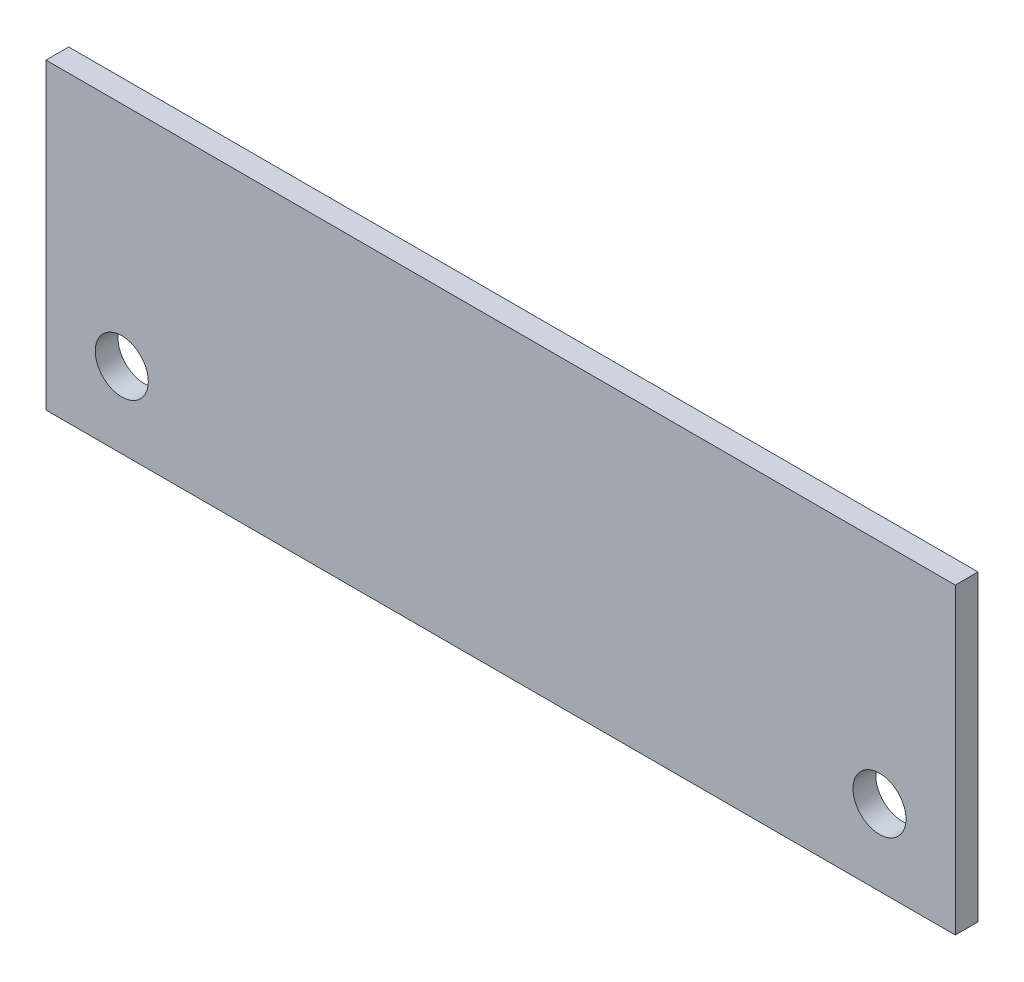
ISO-10303-21;
HEADER;
FILE_DESCRIPTION(('STEP AP214'),'2;1');
FILE_NAME('part.step','',(''),(''),'','','');
FILE_SCHEMA(('AUTOMOTIVE_DESIGN { 1 0 10303 214 1 1 1 1 }'));
ENDSEC;
DATA;
#1=APPLICATION_CONTEXT('core data for automotive mechanical design processes');
#2=APPLICATION_PROTOCOL_DEFINITION('international standard','automotive_design',2000,#1);
#3=PRODUCT_CONTEXT('',#1,'mechanical');
#4=PRODUCT('Part','Part','',(#3));
#5=PRODUCT_RELATED_PRODUCT_CATEGORY('part','',(#4));
#6=PRODUCT_DEFINITION_FORMATION('','',#4);
#7=PRODUCT_DEFINITION_CONTEXT('part definition',#1,'design');
#8=PRODUCT_DEFINITION('design','',#6,#7);
#9=PRODUCT_DEFINITION_SHAPE('','',#8);
#10=(LENGTH_UNIT() NAMED_UNIT(*) SI_UNIT(.MILLI.,.METRE.));
#11=(NAMED_UNIT(*) PLANE_ANGLE_UNIT() SI_UNIT($,.RADIAN.));
#12=(NAMED_UNIT(*) SI_UNIT($,.STERADIAN.) SOLID_ANGLE_UNIT());
#13=UNCERTAINTY_MEASURE_WITH_UNIT(LENGTH_MEASURE(1.E-05),#10,'distance_accuracy_value','');
#14=(GEOMETRIC_REPRESENTATION_CONTEXT(3) GLOBAL_UNCERTAINTY_ASSIGNED_CONTEXT((#13)) GLOBAL_UNIT_ASSIGNED_CONTEXT((#10,
#11,#12)) REPRESENTATION_CONTEXT('',''));
#15=CARTESIAN_POINT('',(0.,0.,0.));
#16=DIRECTION('',(0.,0.,1.));
#17=DIRECTION('',(1.,0.,0.));
#18=AXIS2_PLACEMENT_3D('',#15,#16,#17);
#19=CARTESIAN_POINT('',(0.,0.,6.));
#20=DIRECTION('',(0.,0.,-1.));
#21=DIRECTION('',(-1.,0.,0.));
#22=AXIS2_PLACEMENT_3D('',#19,#20,#21);
#23=PLANE('',#22);
#24=DIRECTION('',(0.,1.,0.));
#25=VECTOR('',#24,1.);
#26=CARTESIAN_POINT('',(120.,-40.,6.));
#27=LINE('',#26,#25);
#28=CARTESIAN_POINT('',(120.,-40.,6.));
#29=VERTEX_POINT('',#28);
#30=CARTESIAN_POINT('',(120.,40.,6.));
#31=VERTEX_POINT('',#30);
#32=EDGE_CURVE('E85',#29,#31,#27,.T.);
#33=ORIENTED_EDGE('',*,*,#32,.T.);
#34=DIRECTION('',(-1.,0.,0.));
#35=VECTOR('',#34,1.);
#36=CARTESIAN_POINT('',(-120.,40.,6.));
#37=LINE('',#36,#35);
#38=CARTESIAN_POINT('',(-120.,40.,6.));
#39=VERTEX_POINT('',#38);
#40=EDGE_CURVE('E80',#31,#39,#37,.T.);
#41=ORIENTED_EDGE('',*,*,#40,.T.);
#42=DIRECTION('',(0.,-1.,0.));
#43=VECTOR('',#42,1.);
#44=CARTESIAN_POINT('',(-120.,-40.,6.));
#45=LINE('',#44,#43);
#46=CARTESIAN_POINT('',(-120.,-40.,6.));
#47=VERTEX_POINT('',#46);
#48=EDGE_CURVE('E83',#39,#47,#45,.T.);
#49=ORIENTED_EDGE('',*,*,#48,.T.);
#50=DIRECTION('',(1.,0.,0.));
#51=VECTOR('',#50,1.);
#52=CARTESIAN_POINT('',(-120.,-40.,6.));
#53=LINE('',#52,#51);
#54=EDGE_CURVE('E50',#47,#29,#53,.T.);
#55=ORIENTED_EDGE('',*,*,#54,.T.);
#56=EDGE_LOOP('',(#33,#41,#49,#55));
#57=FACE_BOUND('',#56,.T.);
#58=CARTESIAN_POINT('',(-100.,-20.,6.));
#59=DIRECTION('',(0.,0.,1.));
#60=DIRECTION('',(1.,0.,0.));
#61=AXIS2_PLACEMENT_3D('',#58,#59,#60);
#62=CIRCLE('',#61,7.);
#63=CARTESIAN_POINT('',(-93.,-20.,6.));
#64=VERTEX_POINT('',#63);
#65=EDGE_CURVE('E100',#64,#64,#62,.T.);
#66=ORIENTED_EDGE('',*,*,#65,.F.);
#67=EDGE_LOOP('',(#66));
#68=FACE_BOUND('',#67,.T.);
#69=CARTESIAN_POINT('',(100.,-20.,6.));
#70=DIRECTION('',(0.,0.,1.));
#71=DIRECTION('',(1.,0.,0.));
#72=AXIS2_PLACEMENT_3D('',#69,#70,#71);
#73=CIRCLE('',#72,7.);
#74=CARTESIAN_POINT('',(107.,-20.,6.));
#75=VERTEX_POINT('',#74);
#76=EDGE_CURVE('E115',#75,#75,#73,.T.);
#77=ORIENTED_EDGE('',*,*,#76,.F.);
#78=EDGE_LOOP('',(#77));
#79=FACE_BOUND('',#78,.T.);
#80=ADVANCED_FACE('F33',(#57,#68,#79),#23,.F.);
#81=CARTESIAN_POINT('',(0.,0.,0.));
#82=DIRECTION('',(0.,0.,-1.));
#83=DIRECTION('',(-1.,0.,0.));
#84=AXIS2_PLACEMENT_3D('',#81,#82,#83);
#85=PLANE('',#84);
#86=CARTESIAN_POINT('',(-100.,-20.,0.));
#87=DIRECTION('',(0.,0.,1.));
#88=DIRECTION('',(1.,0.,0.));
#89=AXIS2_PLACEMENT_3D('',#86,#87,#88);
#90=CIRCLE('',#89,7.);
#91=CARTESIAN_POINT('',(-93.,-20.,0.));
#92=VERTEX_POINT('',#91);
#93=EDGE_CURVE('E112',#92,#92,#90,.T.);
#94=ORIENTED_EDGE('',*,*,#93,.T.);
#95=EDGE_LOOP('',(#94));
#96=FACE_BOUND('',#95,.T.);
#97=DIRECTION('',(0.,1.,0.));
#98=VECTOR('',#97,1.);
#99=CARTESIAN_POINT('',(120.,-40.,0.));
#100=LINE('',#99,#98);
#101=CARTESIAN_POINT('',(120.,-40.,0.));
#102=VERTEX_POINT('',#101);
#103=CARTESIAN_POINT('',(120.,40.,0.));
#104=VERTEX_POINT('',#103);
#105=EDGE_CURVE('E97',#102,#104,#100,.T.);
#106=ORIENTED_EDGE('',*,*,#105,.F.);
#107=DIRECTION('',(1.,0.,0.));
#108=VECTOR('',#107,1.);
#109=CARTESIAN_POINT('',(-120.,-40.,0.));
#110=LINE('',#109,#108);
#111=CARTESIAN_POINT('',(-120.,-40.,0.));
#112=VERTEX_POINT('',#111);
#113=EDGE_CURVE('E73',#112,#102,#110,.T.);
#114=ORIENTED_EDGE('',*,*,#113,.F.);
#115=DIRECTION('',(0.,-1.,0.));
#116=VECTOR('',#115,1.);
#117=CARTESIAN_POINT('',(-120.,-40.,0.));
#118=LINE('',#117,#116);
#119=CARTESIAN_POINT('',(-120.,40.,0.));
#120=VERTEX_POINT('',#119);
#121=EDGE_CURVE('E67',#120,#112,#118,.T.);
#122=ORIENTED_EDGE('',*,*,#121,.F.);
#123=DIRECTION('',(-1.,0.,0.));
#124=VECTOR('',#123,1.);
#125=CARTESIAN_POINT('',(-120.,40.,0.));
#126=LINE('',#125,#124);
#127=EDGE_CURVE('E89',#104,#120,#126,.T.);
#128=ORIENTED_EDGE('',*,*,#127,.F.);
#129=EDGE_LOOP('',(#106,#114,#122,#128));
#130=FACE_BOUND('',#129,.T.);
#131=CARTESIAN_POINT('',(100.,-20.,0.));
#132=DIRECTION('',(0.,0.,1.));
#133=DIRECTION('',(1.,0.,0.));
#134=AXIS2_PLACEMENT_3D('',#131,#132,#133);
#135=CIRCLE('',#134,7.);
#136=CARTESIAN_POINT('',(107.,-20.,0.));
#137=VERTEX_POINT('',#136);
#138=EDGE_CURVE('E118',#137,#137,#135,.T.);
#139=ORIENTED_EDGE('',*,*,#138,.T.);
#140=EDGE_LOOP('',(#139));
#141=FACE_BOUND('',#140,.T.);
#142=ADVANCED_FACE('F108',(#96,#130,#141),#85,.T.);
#143=CARTESIAN_POINT('',(120.,-40.,6.));
#144=DIRECTION('',(-1.,0.,0.));
#145=DIRECTION('',(0.,0.,1.));
#146=AXIS2_PLACEMENT_3D('',#143,#144,#145);
#147=PLANE('',#146);
#148=ORIENTED_EDGE('',*,*,#105,.T.);
#149=DIRECTION('',(0.,0.,-1.));
#150=VECTOR('',#149,1.);
#151=CARTESIAN_POINT('',(120.,40.,6.));
#152=LINE('',#151,#150);
#153=EDGE_CURVE('E11',#31,#104,#152,.T.);
#154=ORIENTED_EDGE('',*,*,#153,.F.);
#155=ORIENTED_EDGE('',*,*,#32,.F.);
#156=DIRECTION('',(0.,0.,-1.));
#157=VECTOR('',#156,1.);
#158=CARTESIAN_POINT('',(120.,-40.,6.));
#159=LINE('',#158,#157);
#160=EDGE_CURVE('E93',#29,#102,#159,.T.);
#161=ORIENTED_EDGE('',*,*,#160,.T.);
#162=EDGE_LOOP('',(#148,#154,#155,#161));
#163=FACE_BOUND('',#162,.T.);
#164=ADVANCED_FACE('F35',(#163),#147,.F.);
#165=CARTESIAN_POINT('',(-120.,40.,6.));
#166=DIRECTION('',(0.,-1.,0.));
#167=DIRECTION('',(0.,0.,-1.));
#168=AXIS2_PLACEMENT_3D('',#165,#166,#167);
#169=PLANE('',#168);
#170=ORIENTED_EDGE('',*,*,#127,.T.);
#171=DIRECTION('',(0.,0.,-1.));
#172=VECTOR('',#171,1.);
#173=CARTESIAN_POINT('',(-120.,40.,6.));
#174=LINE('',#173,#172);
#175=EDGE_CURVE('E42',#39,#120,#174,.T.);
#176=ORIENTED_EDGE('',*,*,#175,.F.);
#177=ORIENTED_EDGE('',*,*,#40,.F.);
#178=ORIENTED_EDGE('',*,*,#153,.T.);
#179=EDGE_LOOP('',(#170,#176,#177,#178));
#180=FACE_BOUND('',#179,.T.);
#181=ADVANCED_FACE('F88',(#180),#169,.F.);
#182=CARTESIAN_POINT('',(-120.,-40.,6.));
#183=DIRECTION('',(1.,0.,0.));
#184=DIRECTION('',(0.,0.,-1.));
#185=AXIS2_PLACEMENT_3D('',#182,#183,#184);
#186=PLANE('',#185);
#187=ORIENTED_EDGE('',*,*,#121,.T.);
#188=DIRECTION('',(0.,0.,-1.));
#189=VECTOR('',#188,1.);
#190=CARTESIAN_POINT('',(-120.,-40.,6.));
#191=LINE('',#190,#189);
#192=EDGE_CURVE('E90',#47,#112,#191,.T.);
#193=ORIENTED_EDGE('',*,*,#192,.F.);
#194=ORIENTED_EDGE('',*,*,#48,.F.);
#195=ORIENTED_EDGE('',*,*,#175,.T.);
#196=EDGE_LOOP('',(#187,#193,#194,#195));
#197=FACE_BOUND('',#196,.T.);
#198=ADVANCED_FACE('F91',(#197),#186,.F.);
#199=CARTESIAN_POINT('',(-120.,-40.,6.));
#200=DIRECTION('',(0.,1.,0.));
#201=DIRECTION('',(0.,0.,1.));
#202=AXIS2_PLACEMENT_3D('',#199,#200,#201);
#203=PLANE('',#202);
#204=ORIENTED_EDGE('',*,*,#113,.T.);
#205=ORIENTED_EDGE('',*,*,#160,.F.);
#206=ORIENTED_EDGE('',*,*,#54,.F.);
#207=ORIENTED_EDGE('',*,*,#192,.T.);
#208=EDGE_LOOP('',(#204,#205,#206,#207));
#209=FACE_BOUND('',#208,.T.);
#210=ADVANCED_FACE('F105',(#209),#203,.F.);
#211=CARTESIAN_POINT('',(-100.,-20.,6.));
#212=DIRECTION('',(0.,0.,-1.));
#213=DIRECTION('',(-1.,0.,0.));
#214=AXIS2_PLACEMENT_3D('',#211,#212,#213);
#215=CYLINDRICAL_SURFACE('',#214,7.);
#216=ORIENTED_EDGE('',*,*,#65,.T.);
#217=EDGE_LOOP('',(#216));
#218=FACE_BOUND('',#217,.T.);
#219=ORIENTED_EDGE('',*,*,#93,.F.);
#220=EDGE_LOOP('',(#219));
#221=FACE_BOUND('',#220,.T.);
#222=ADVANCED_FACE('F135',(#218,#221),#215,.F.);
#223=CARTESIAN_POINT('',(100.,-20.,6.));
#224=DIRECTION('',(0.,0.,-1.));
#225=DIRECTION('',(-1.,0.,0.));
#226=AXIS2_PLACEMENT_3D('',#223,#224,#225);
#227=CYLINDRICAL_SURFACE('',#226,7.);
#228=ORIENTED_EDGE('',*,*,#76,.T.);
#229=EDGE_LOOP('',(#228));
#230=FACE_BOUND('',#229,.T.);
#231=ORIENTED_EDGE('',*,*,#138,.F.);
#232=EDGE_LOOP('',(#231));
#233=FACE_BOUND('',#232,.T.);
#234=ADVANCED_FACE('F124',(#230,#233),#227,.F.);
#235=CLOSED_SHELL('',(#80,#142,#164,#181,#198,#210,#222,#234));
#236=MANIFOLD_SOLID_BREP('B2',#235);
#237=ADVANCED_BREP_SHAPE_REPRESENTATION('',(#18,#236),#14);
#238=SHAPE_DEFINITION_REPRESENTATION(#9,#237);
ENDSEC;
END-ISO-10303-21;
